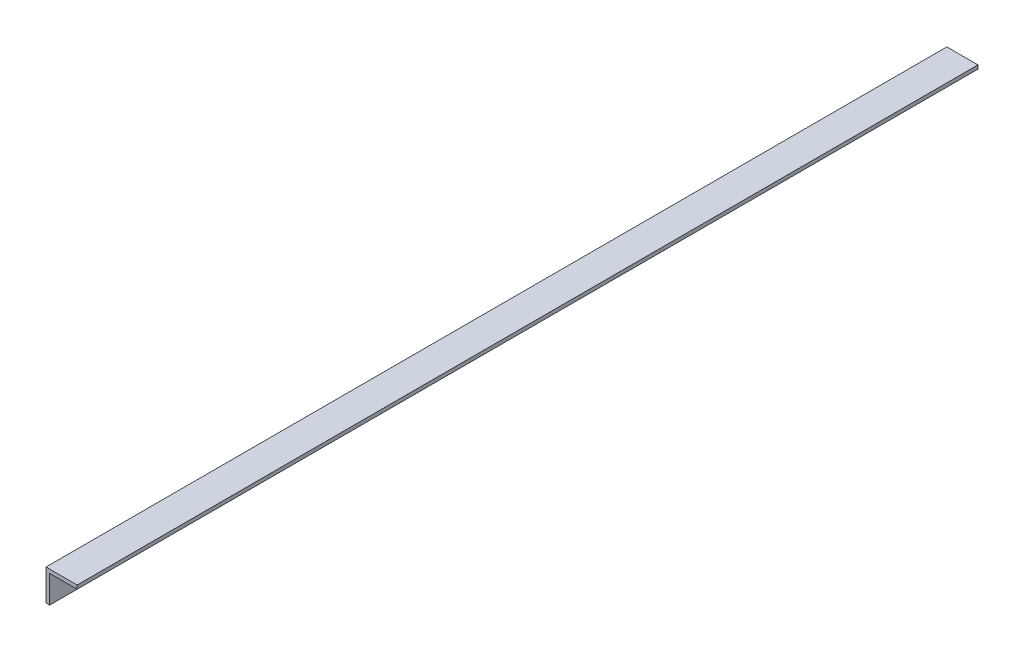
ISO-10303-21;
HEADER;
FILE_DESCRIPTION(('STEP AP214'),'2;1');
FILE_NAME('part.step','',(''),(''),'','','');
FILE_SCHEMA(('AUTOMOTIVE_DESIGN { 1 0 10303 214 1 1 1 1 }'));
ENDSEC;
DATA;
#1=APPLICATION_CONTEXT('core data for automotive mechanical design processes');
#2=APPLICATION_PROTOCOL_DEFINITION('international standard','automotive_design',2000,#1);
#3=PRODUCT_CONTEXT('',#1,'mechanical');
#4=PRODUCT('Part','Part','',(#3));
#5=PRODUCT_RELATED_PRODUCT_CATEGORY('part','',(#4));
#6=PRODUCT_DEFINITION_FORMATION('','',#4);
#7=PRODUCT_DEFINITION_CONTEXT('part definition',#1,'design');
#8=PRODUCT_DEFINITION('design','',#6,#7);
#9=PRODUCT_DEFINITION_SHAPE('','',#8);
#10=(LENGTH_UNIT() NAMED_UNIT(*) SI_UNIT(.MILLI.,.METRE.));
#11=(NAMED_UNIT(*) PLANE_ANGLE_UNIT() SI_UNIT($,.RADIAN.));
#12=(NAMED_UNIT(*) SI_UNIT($,.STERADIAN.) SOLID_ANGLE_UNIT());
#13=UNCERTAINTY_MEASURE_WITH_UNIT(LENGTH_MEASURE(1.E-05),#10,'distance_accuracy_value','');
#14=(GEOMETRIC_REPRESENTATION_CONTEXT(3) GLOBAL_UNCERTAINTY_ASSIGNED_CONTEXT((#13)) GLOBAL_UNIT_ASSIGNED_CONTEXT((#10,
#11,#12)) REPRESENTATION_CONTEXT('',''));
#15=CARTESIAN_POINT('',(0.,0.,0.));
#16=DIRECTION('',(0.,0.,1.));
#17=DIRECTION('',(1.,0.,0.));
#18=AXIS2_PLACEMENT_3D('',#15,#16,#17);
#19=CARTESIAN_POINT('',(0.,0.,367.1));
#20=DIRECTION('',(-1.,0.,0.));
#21=DIRECTION('',(0.,-1.,0.));
#22=AXIS2_PLACEMENT_3D('',#19,#20,#21);
#23=PLANE('',#22);
#24=DIRECTION('',(0.,1.,0.));
#25=VECTOR('',#24,1.);
#26=CARTESIAN_POINT('',(0.,0.,0.));
#27=LINE('',#26,#25);
#28=CARTESIAN_POINT('',(0.,-1.5,0.));
#29=VERTEX_POINT('',#28);
#30=CARTESIAN_POINT('',(0.,0.,0.));
#31=VERTEX_POINT('',#30);
#32=EDGE_CURVE('E128',#29,#31,#27,.T.);
#33=ORIENTED_EDGE('',*,*,#32,.T.);
#34=DIRECTION('',(0.,0.,-1.));
#35=VECTOR('',#34,1.);
#36=CARTESIAN_POINT('',(0.,0.,367.1));
#37=LINE('',#36,#35);
#38=CARTESIAN_POINT('',(0.,0.,367.1));
#39=VERTEX_POINT('',#38);
#40=EDGE_CURVE('E11',#39,#31,#37,.T.);
#41=ORIENTED_EDGE('',*,*,#40,.F.);
#42=DIRECTION('',(0.,1.,0.));
#43=VECTOR('',#42,1.);
#44=CARTESIAN_POINT('',(0.,0.,367.1));
#45=LINE('',#44,#43);
#46=CARTESIAN_POINT('',(0.,-1.5,367.1));
#47=VERTEX_POINT('',#46);
#48=EDGE_CURVE('E144',#47,#39,#45,.T.);
#49=ORIENTED_EDGE('',*,*,#48,.F.);
#50=DIRECTION('',(0.,0.,-1.));
#51=VECTOR('',#50,1.);
#52=CARTESIAN_POINT('',(0.,-1.5,367.1));
#53=LINE('',#52,#51);
#54=EDGE_CURVE('E124',#47,#29,#53,.T.);
#55=ORIENTED_EDGE('',*,*,#54,.T.);
#56=EDGE_LOOP('',(#33,#41,#49,#55));
#57=FACE_BOUND('',#56,.T.);
#58=ADVANCED_FACE('F39',(#57),#23,.F.);
#59=CARTESIAN_POINT('',(0.,0.,367.1));
#60=DIRECTION('',(0.,-1.,0.));
#61=DIRECTION('',(0.,0.,-1.));
#62=AXIS2_PLACEMENT_3D('',#59,#60,#61);
#63=PLANE('',#62);
#64=DIRECTION('',(-1.,0.,0.));
#65=VECTOR('',#64,1.);
#66=CARTESIAN_POINT('',(0.,0.,0.));
#67=LINE('',#66,#65);
#68=CARTESIAN_POINT('',(-12.7,0.,0.));
#69=VERTEX_POINT('',#68);
#70=EDGE_CURVE('E132',#31,#69,#67,.T.);
#71=ORIENTED_EDGE('',*,*,#70,.T.);
#72=DIRECTION('',(0.,0.,-1.));
#73=VECTOR('',#72,1.);
#74=CARTESIAN_POINT('',(-12.7,0.,367.1));
#75=LINE('',#74,#73);
#76=CARTESIAN_POINT('',(-12.7,0.,367.1));
#77=VERTEX_POINT('',#76);
#78=EDGE_CURVE('E48',#77,#69,#75,.T.);
#79=ORIENTED_EDGE('',*,*,#78,.F.);
#80=DIRECTION('',(-1.,0.,0.));
#81=VECTOR('',#80,1.);
#82=CARTESIAN_POINT('',(0.,0.,367.1));
#83=LINE('',#82,#81);
#84=EDGE_CURVE('E93',#39,#77,#83,.T.);
#85=ORIENTED_EDGE('',*,*,#84,.F.);
#86=ORIENTED_EDGE('',*,*,#40,.T.);
#87=EDGE_LOOP('',(#71,#79,#85,#86));
#88=FACE_BOUND('',#87,.T.);
#89=ADVANCED_FACE('F172',(#88),#63,.F.);
#90=CARTESIAN_POINT('',(-12.7,0.,367.1));
#91=DIRECTION('',(1.,0.,0.));
#92=DIRECTION('',(0.,1.,0.));
#93=AXIS2_PLACEMENT_3D('',#90,#91,#92);
#94=PLANE('',#93);
#95=DIRECTION('',(0.,-1.,0.));
#96=VECTOR('',#95,1.);
#97=CARTESIAN_POINT('',(-12.7,0.,0.));
#98=LINE('',#97,#96);
#99=CARTESIAN_POINT('',(-12.7,-12.7,0.));
#100=VERTEX_POINT('',#99);
#101=EDGE_CURVE('E135',#69,#100,#98,.T.);
#102=ORIENTED_EDGE('',*,*,#101,.T.);
#103=DIRECTION('',(0.,0.,-1.));
#104=VECTOR('',#103,1.);
#105=CARTESIAN_POINT('',(-12.7,-12.7,367.1));
#106=LINE('',#105,#104);
#107=CARTESIAN_POINT('',(-12.7,-12.7,367.1));
#108=VERTEX_POINT('',#107);
#109=EDGE_CURVE('E117',#108,#100,#106,.T.);
#110=ORIENTED_EDGE('',*,*,#109,.F.);
#111=DIRECTION('',(0.,-1.,0.));
#112=VECTOR('',#111,1.);
#113=CARTESIAN_POINT('',(-12.7,0.,367.1));
#114=LINE('',#113,#112);
#115=EDGE_CURVE('E106',#77,#108,#114,.T.);
#116=ORIENTED_EDGE('',*,*,#115,.F.);
#117=ORIENTED_EDGE('',*,*,#78,.T.);
#118=EDGE_LOOP('',(#102,#110,#116,#117));
#119=FACE_BOUND('',#118,.T.);
#120=ADVANCED_FACE('F154',(#119),#94,.F.);
#121=CARTESIAN_POINT('',(-11.2,-12.7,367.1));
#122=DIRECTION('',(0.,1.,0.));
#123=DIRECTION('',(-1.,0.,0.));
#124=AXIS2_PLACEMENT_3D('',#121,#122,#123);
#125=PLANE('',#124);
#126=DIRECTION('',(1.,0.,0.));
#127=VECTOR('',#126,1.);
#128=CARTESIAN_POINT('',(-11.2,-12.7,0.));
#129=LINE('',#128,#127);
#130=CARTESIAN_POINT('',(-11.2,-12.7,0.));
#131=VERTEX_POINT('',#130);
#132=EDGE_CURVE('E115',#100,#131,#129,.T.);
#133=ORIENTED_EDGE('',*,*,#132,.T.);
#134=DIRECTION('',(0.,0.,-1.));
#135=VECTOR('',#134,1.);
#136=CARTESIAN_POINT('',(-11.2,-12.7,367.1));
#137=LINE('',#136,#135);
#138=CARTESIAN_POINT('',(-11.2,-12.7,367.1));
#139=VERTEX_POINT('',#138);
#140=EDGE_CURVE('E112',#139,#131,#137,.T.);
#141=ORIENTED_EDGE('',*,*,#140,.F.);
#142=DIRECTION('',(1.,0.,0.));
#143=VECTOR('',#142,1.);
#144=CARTESIAN_POINT('',(-11.2,-12.7,367.1));
#145=LINE('',#144,#143);
#146=EDGE_CURVE('E100',#108,#139,#145,.T.);
#147=ORIENTED_EDGE('',*,*,#146,.F.);
#148=ORIENTED_EDGE('',*,*,#109,.T.);
#149=EDGE_LOOP('',(#133,#141,#147,#148));
#150=FACE_BOUND('',#149,.T.);
#151=ADVANCED_FACE('F113',(#150),#125,.F.);
#152=CARTESIAN_POINT('',(-11.2,-1.5,367.1));
#153=DIRECTION('',(-1.,0.,0.));
#154=DIRECTION('',(0.,-1.,0.));
#155=AXIS2_PLACEMENT_3D('',#152,#153,#154);
#156=PLANE('',#155);
#157=DIRECTION('',(0.,1.,0.));
#158=VECTOR('',#157,1.);
#159=CARTESIAN_POINT('',(-11.2,-1.5,0.));
#160=LINE('',#159,#158);
#161=CARTESIAN_POINT('',(-11.2,-1.5,0.));
#162=VERTEX_POINT('',#161);
#163=EDGE_CURVE('E79',#131,#162,#160,.T.);
#164=ORIENTED_EDGE('',*,*,#163,.T.);
#165=DIRECTION('',(0.,0.,-1.));
#166=VECTOR('',#165,1.);
#167=CARTESIAN_POINT('',(-11.2,-1.5,367.1));
#168=LINE('',#167,#166);
#169=CARTESIAN_POINT('',(-11.2,-1.5,367.1));
#170=VERTEX_POINT('',#169);
#171=EDGE_CURVE('E118',#170,#162,#168,.T.);
#172=ORIENTED_EDGE('',*,*,#171,.F.);
#173=DIRECTION('',(0.,1.,0.));
#174=VECTOR('',#173,1.);
#175=CARTESIAN_POINT('',(-11.2,-1.5,367.1));
#176=LINE('',#175,#174);
#177=EDGE_CURVE('E104',#139,#170,#176,.T.);
#178=ORIENTED_EDGE('',*,*,#177,.F.);
#179=ORIENTED_EDGE('',*,*,#140,.T.);
#180=EDGE_LOOP('',(#164,#172,#178,#179));
#181=FACE_BOUND('',#180,.T.);
#182=ADVANCED_FACE('F120',(#181),#156,.F.);
#183=CARTESIAN_POINT('',(0.,-1.5,367.1));
#184=DIRECTION('',(0.,1.,0.));
#185=DIRECTION('',(-1.,0.,0.));
#186=AXIS2_PLACEMENT_3D('',#183,#184,#185);
#187=PLANE('',#186);
#188=DIRECTION('',(1.,0.,0.));
#189=VECTOR('',#188,1.);
#190=CARTESIAN_POINT('',(0.,-1.5,0.));
#191=LINE('',#190,#189);
#192=EDGE_CURVE('E85',#162,#29,#191,.T.);
#193=ORIENTED_EDGE('',*,*,#192,.T.);
#194=ORIENTED_EDGE('',*,*,#54,.F.);
#195=DIRECTION('',(1.,0.,0.));
#196=VECTOR('',#195,1.);
#197=CARTESIAN_POINT('',(0.,-1.5,367.1));
#198=LINE('',#197,#196);
#199=EDGE_CURVE('E56',#170,#47,#198,.T.);
#200=ORIENTED_EDGE('',*,*,#199,.F.);
#201=ORIENTED_EDGE('',*,*,#171,.T.);
#202=EDGE_LOOP('',(#193,#194,#200,#201));
#203=FACE_BOUND('',#202,.T.);
#204=ADVANCED_FACE('F161',(#203),#187,.F.);
#205=CARTESIAN_POINT('',(0.,0.,367.1));
#206=DIRECTION('',(0.,0.,-1.));
#207=DIRECTION('',(-1.,0.,0.));
#208=AXIS2_PLACEMENT_3D('',#205,#206,#207);
#209=PLANE('',#208);
#210=ORIENTED_EDGE('',*,*,#48,.T.);
#211=ORIENTED_EDGE('',*,*,#84,.T.);
#212=ORIENTED_EDGE('',*,*,#115,.T.);
#213=ORIENTED_EDGE('',*,*,#146,.T.);
#214=ORIENTED_EDGE('',*,*,#177,.T.);
#215=ORIENTED_EDGE('',*,*,#199,.T.);
#216=EDGE_LOOP('',(#210,#211,#212,#213,#214,#215));
#217=FACE_BOUND('',#216,.T.);
#218=ADVANCED_FACE('F102',(#217),#209,.F.);
#219=CARTESIAN_POINT('',(0.,0.,0.));
#220=DIRECTION('',(0.,0.,-1.));
#221=DIRECTION('',(-1.,0.,0.));
#222=AXIS2_PLACEMENT_3D('',#219,#220,#221);
#223=PLANE('',#222);
#224=ORIENTED_EDGE('',*,*,#32,.F.);
#225=ORIENTED_EDGE('',*,*,#192,.F.);
#226=ORIENTED_EDGE('',*,*,#163,.F.);
#227=ORIENTED_EDGE('',*,*,#132,.F.);
#228=ORIENTED_EDGE('',*,*,#101,.F.);
#229=ORIENTED_EDGE('',*,*,#70,.F.);
#230=EDGE_LOOP('',(#224,#225,#226,#227,#228,#229));
#231=FACE_BOUND('',#230,.T.);
#232=ADVANCED_FACE('F157',(#231),#223,.T.);
#233=CLOSED_SHELL('',(#58,#89,#120,#151,#182,#204,#218,#232));
#234=MANIFOLD_SOLID_BREP('B2',#233);
#235=ADVANCED_BREP_SHAPE_REPRESENTATION('',(#18,#234),#14);
#236=SHAPE_DEFINITION_REPRESENTATION(#9,#235);
ENDSEC;
END-ISO-10303-21;
